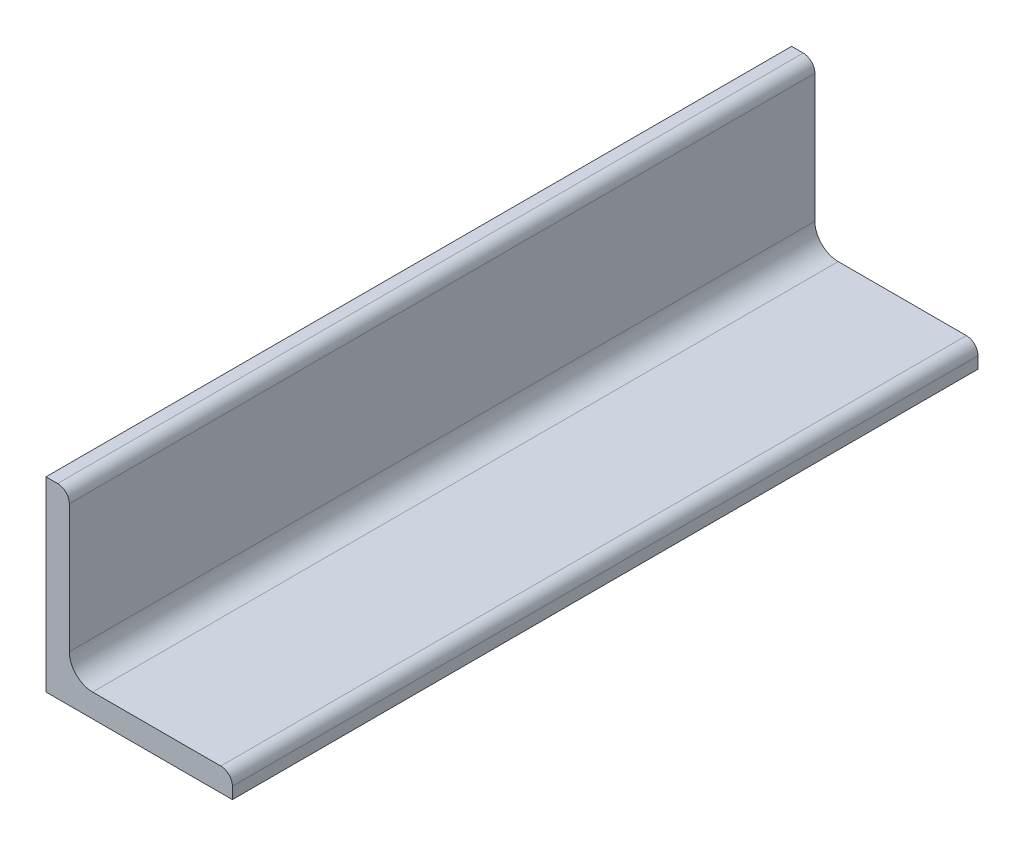
ISO-10303-21;
HEADER;
FILE_DESCRIPTION(('STEP AP214'),'2;1');
FILE_NAME('part.step','',(''),(''),'','','');
FILE_SCHEMA(('AUTOMOTIVE_DESIGN { 1 0 10303 214 1 1 1 1 }'));
ENDSEC;
DATA;
#1=APPLICATION_CONTEXT('core data for automotive mechanical design processes');
#2=APPLICATION_PROTOCOL_DEFINITION('international standard','automotive_design',2000,#1);
#3=PRODUCT_CONTEXT('',#1,'mechanical');
#4=PRODUCT('Part','Part','',(#3));
#5=PRODUCT_RELATED_PRODUCT_CATEGORY('part','',(#4));
#6=PRODUCT_DEFINITION_FORMATION('','',#4);
#7=PRODUCT_DEFINITION_CONTEXT('part definition',#1,'design');
#8=PRODUCT_DEFINITION('design','',#6,#7);
#9=PRODUCT_DEFINITION_SHAPE('','',#8);
#10=(LENGTH_UNIT() NAMED_UNIT(*) SI_UNIT(.MILLI.,.METRE.));
#11=(NAMED_UNIT(*) PLANE_ANGLE_UNIT() SI_UNIT($,.RADIAN.));
#12=(NAMED_UNIT(*) SI_UNIT($,.STERADIAN.) SOLID_ANGLE_UNIT());
#13=UNCERTAINTY_MEASURE_WITH_UNIT(LENGTH_MEASURE(1.E-05),#10,'distance_accuracy_value','');
#14=(GEOMETRIC_REPRESENTATION_CONTEXT(3) GLOBAL_UNCERTAINTY_ASSIGNED_CONTEXT((#13)) GLOBAL_UNIT_ASSIGNED_CONTEXT((#10,
#11,#12)) REPRESENTATION_CONTEXT('',''));
#15=CARTESIAN_POINT('',(0.,0.,0.));
#16=DIRECTION('',(0.,0.,1.));
#17=DIRECTION('',(1.,0.,0.));
#18=AXIS2_PLACEMENT_3D('',#15,#16,#17);
#19=CARTESIAN_POINT('',(0.490776827053332,76.2882459217981,304.8));
#20=DIRECTION('',(1.,0.,0.));
#21=DIRECTION('',(0.,0.,-1.));
#22=AXIS2_PLACEMENT_3D('',#19,#20,#21);
#23=PLANE('',#22);
#24=DIRECTION('',(0.,-1.,0.));
#25=VECTOR('',#24,1.);
#26=CARTESIAN_POINT('',(0.490776827053332,76.2882459217981,0.));
#27=LINE('',#26,#25);
#28=CARTESIAN_POINT('',(0.490776827053332,76.2882459217981,0.));
#29=VERTEX_POINT('',#28);
#30=CARTESIAN_POINT('',(0.490776827053332,0.0882459217980795,0.));
#31=VERTEX_POINT('',#30);
#32=EDGE_CURVE('E135',#29,#31,#27,.T.);
#33=ORIENTED_EDGE('',*,*,#32,.T.);
#34=DIRECTION('',(0.,0.,-1.));
#35=VECTOR('',#34,1.);
#36=CARTESIAN_POINT('',(0.490776827053332,0.0882459217980795,304.8));
#37=LINE('',#36,#35);
#38=CARTESIAN_POINT('',(0.490776827053332,0.0882459217980795,304.8));
#39=VERTEX_POINT('',#38);
#40=EDGE_CURVE('E11',#39,#31,#37,.T.);
#41=ORIENTED_EDGE('',*,*,#40,.F.);
#42=DIRECTION('',(0.,-1.,0.));
#43=VECTOR('',#42,1.);
#44=CARTESIAN_POINT('',(0.490776827053332,76.2882459217981,304.8));
#45=LINE('',#44,#43);
#46=CARTESIAN_POINT('',(0.490776827053332,76.2882459217981,304.8));
#47=VERTEX_POINT('',#46);
#48=EDGE_CURVE('E151',#47,#39,#45,.T.);
#49=ORIENTED_EDGE('',*,*,#48,.F.);
#50=DIRECTION('',(0.,0.,-1.));
#51=VECTOR('',#50,1.);
#52=CARTESIAN_POINT('',(0.490776827053332,76.2882459217981,304.8));
#53=LINE('',#52,#51);
#54=EDGE_CURVE('E131',#47,#29,#53,.T.);
#55=ORIENTED_EDGE('',*,*,#54,.T.);
#56=EDGE_LOOP('',(#33,#41,#49,#55));
#57=FACE_BOUND('',#56,.T.);
#58=ADVANCED_FACE('F33',(#57),#23,.F.);
#59=CARTESIAN_POINT('',(0.490776827053332,0.0882459217980795,304.8));
#60=DIRECTION('',(0.,1.,0.));
#61=DIRECTION('',(0.,0.,1.));
#62=AXIS2_PLACEMENT_3D('',#59,#60,#61);
#63=PLANE('',#62);
#64=DIRECTION('',(1.,0.,0.));
#65=VECTOR('',#64,1.);
#66=CARTESIAN_POINT('',(0.490776827053332,0.0882459217980795,0.));
#67=LINE('',#66,#65);
#68=CARTESIAN_POINT('',(76.6907768270533,0.0882459217980795,0.));
#69=VERTEX_POINT('',#68);
#70=EDGE_CURVE('E138',#31,#69,#67,.T.);
#71=ORIENTED_EDGE('',*,*,#70,.T.);
#72=DIRECTION('',(0.,0.,-1.));
#73=VECTOR('',#72,1.);
#74=CARTESIAN_POINT('',(76.6907768270533,0.0882459217980795,304.8));
#75=LINE('',#74,#73);
#76=CARTESIAN_POINT('',(76.6907768270533,0.0882459217980795,304.8));
#77=VERTEX_POINT('',#76);
#78=EDGE_CURVE('E41',#77,#69,#75,.T.);
#79=ORIENTED_EDGE('',*,*,#78,.F.);
#80=DIRECTION('',(1.,0.,0.));
#81=VECTOR('',#80,1.);
#82=CARTESIAN_POINT('',(0.490776827053332,0.0882459217980795,304.8));
#83=LINE('',#82,#81);
#84=EDGE_CURVE('E95',#39,#77,#83,.T.);
#85=ORIENTED_EDGE('',*,*,#84,.F.);
#86=ORIENTED_EDGE('',*,*,#40,.T.);
#87=EDGE_LOOP('',(#71,#79,#85,#86));
#88=FACE_BOUND('',#87,.T.);
#89=ADVANCED_FACE('F194',(#88),#63,.F.);
#90=CARTESIAN_POINT('',(76.6907768270533,0.0882459217980795,304.8));
#91=DIRECTION('',(-1.,0.,0.));
#92=DIRECTION('',(0.,0.,1.));
#93=AXIS2_PLACEMENT_3D('',#90,#91,#92);
#94=PLANE('',#93);
#95=DIRECTION('',(0.,1.,0.));
#96=VECTOR('',#95,1.);
#97=CARTESIAN_POINT('',(76.6907768270533,0.0882459217980795,0.));
#98=LINE('',#97,#96);
#99=CARTESIAN_POINT('',(76.6907768270533,4.85074592179808,0.));
#100=VERTEX_POINT('',#99);
#101=EDGE_CURVE('E140',#69,#100,#98,.T.);
#102=ORIENTED_EDGE('',*,*,#101,.T.);
#103=DIRECTION('',(0.,0.,-1.));
#104=VECTOR('',#103,1.);
#105=CARTESIAN_POINT('',(76.6907768270533,4.85074592179808,304.8));
#106=LINE('',#105,#104);
#107=CARTESIAN_POINT('',(76.6907768270533,4.85074592179808,304.8));
#108=VERTEX_POINT('',#107);
#109=EDGE_CURVE('E161',#108,#100,#106,.T.);
#110=ORIENTED_EDGE('',*,*,#109,.F.);
#111=DIRECTION('',(0.,1.,0.));
#112=VECTOR('',#111,1.);
#113=CARTESIAN_POINT('',(76.6907768270533,0.0882459217980795,304.8));
#114=LINE('',#113,#112);
#115=EDGE_CURVE('E169',#77,#108,#114,.T.);
#116=ORIENTED_EDGE('',*,*,#115,.F.);
#117=ORIENTED_EDGE('',*,*,#78,.T.);
#118=EDGE_LOOP('',(#102,#110,#116,#117));
#119=FACE_BOUND('',#118,.T.);
#120=ADVANCED_FACE('F167',(#119),#94,.F.);
#121=CARTESIAN_POINT('',(71.9282768270533,4.85074592179808,304.8));
#122=DIRECTION('',(0.,0.,-1.));
#123=DIRECTION('',(-1.,0.,0.));
#124=AXIS2_PLACEMENT_3D('',#121,#122,#123);
#125=CYLINDRICAL_SURFACE('',#124,4.7625);
#126=CARTESIAN_POINT('',(71.9282768270533,4.85074592179808,0.));
#127=DIRECTION('',(0.,0.,1.));
#128=DIRECTION('',(1.,0.,0.));
#129=AXIS2_PLACEMENT_3D('',#126,#127,#128);
#130=CIRCLE('',#129,4.7625);
#131=CARTESIAN_POINT('',(71.9282768270533,9.61324592179808,0.));
#132=VERTEX_POINT('',#131);
#133=EDGE_CURVE('E142',#100,#132,#130,.T.);
#134=ORIENTED_EDGE('',*,*,#133,.T.);
#135=DIRECTION('',(0.,0.,-1.));
#136=VECTOR('',#135,1.);
#137=CARTESIAN_POINT('',(71.9282768270533,9.61324592179808,304.8));
#138=LINE('',#137,#136);
#139=CARTESIAN_POINT('',(71.9282768270533,9.61324592179808,304.8));
#140=VERTEX_POINT('',#139);
#141=EDGE_CURVE('E158',#140,#132,#138,.T.);
#142=ORIENTED_EDGE('',*,*,#141,.F.);
#143=CARTESIAN_POINT('',(71.9282768270533,4.85074592179808,304.8));
#144=DIRECTION('',(0.,0.,1.));
#145=DIRECTION('',(1.,0.,0.));
#146=AXIS2_PLACEMENT_3D('',#143,#144,#145);
#147=CIRCLE('',#146,4.7625);
#148=EDGE_CURVE('E185',#108,#140,#147,.T.);
#149=ORIENTED_EDGE('',*,*,#148,.F.);
#150=ORIENTED_EDGE('',*,*,#109,.T.);
#151=EDGE_LOOP('',(#134,#142,#149,#150));
#152=FACE_BOUND('',#151,.T.);
#153=ADVANCED_FACE('F178',(#152),#125,.T.);
#154=CARTESIAN_POINT('',(71.9282768270533,9.61324592179808,304.8));
#155=DIRECTION('',(0.,-1.,0.));
#156=DIRECTION('',(0.,0.,-1.));
#157=AXIS2_PLACEMENT_3D('',#154,#155,#156);
#158=PLANE('',#157);
#159=DIRECTION('',(-1.,0.,0.));
#160=VECTOR('',#159,1.);
#161=CARTESIAN_POINT('',(71.9282768270533,9.61324592179808,0.));
#162=LINE('',#161,#160);
#163=CARTESIAN_POINT('',(19.5407768270533,9.61324592179808,0.));
#164=VERTEX_POINT('',#163);
#165=EDGE_CURVE('E144',#132,#164,#162,.T.);
#166=ORIENTED_EDGE('',*,*,#165,.T.);
#167=DIRECTION('',(0.,0.,-1.));
#168=VECTOR('',#167,1.);
#169=CARTESIAN_POINT('',(19.5407768270533,9.61324592179808,304.8));
#170=LINE('',#169,#168);
#171=CARTESIAN_POINT('',(19.5407768270533,9.61324592179808,304.8));
#172=VERTEX_POINT('',#171);
#173=EDGE_CURVE('E155',#172,#164,#170,.T.);
#174=ORIENTED_EDGE('',*,*,#173,.F.);
#175=DIRECTION('',(-1.,0.,0.));
#176=VECTOR('',#175,1.);
#177=CARTESIAN_POINT('',(71.9282768270533,9.61324592179808,304.8));
#178=LINE('',#177,#176);
#179=EDGE_CURVE('E184',#140,#172,#178,.T.);
#180=ORIENTED_EDGE('',*,*,#179,.F.);
#181=ORIENTED_EDGE('',*,*,#141,.T.);
#182=EDGE_LOOP('',(#166,#174,#180,#181));
#183=FACE_BOUND('',#182,.T.);
#184=ADVANCED_FACE('F182',(#183),#158,.F.);
#185=CARTESIAN_POINT('',(19.5407768270533,19.1382459217981,304.8));
#186=DIRECTION('',(0.,0.,-1.));
#187=DIRECTION('',(-1.,0.,0.));
#188=AXIS2_PLACEMENT_3D('',#185,#186,#187);
#189=CYLINDRICAL_SURFACE('',#188,9.52499999999999);
#190=CARTESIAN_POINT('',(19.5407768270533,19.1382459217981,0.));
#191=DIRECTION('',(0.,0.,-1.));
#192=DIRECTION('',(1.,0.,0.));
#193=AXIS2_PLACEMENT_3D('',#190,#191,#192);
#194=CIRCLE('',#193,9.52499999999999);
#195=CARTESIAN_POINT('',(10.0157768270533,19.1382459217981,0.));
#196=VERTEX_POINT('',#195);
#197=EDGE_CURVE('E146',#164,#196,#194,.T.);
#198=ORIENTED_EDGE('',*,*,#197,.T.);
#199=DIRECTION('',(0.,0.,-1.));
#200=VECTOR('',#199,1.);
#201=CARTESIAN_POINT('',(10.0157768270533,19.1382459217981,304.8));
#202=LINE('',#201,#200);
#203=CARTESIAN_POINT('',(10.0157768270533,19.1382459217981,304.8));
#204=VERTEX_POINT('',#203);
#205=EDGE_CURVE('E126',#204,#196,#202,.T.);
#206=ORIENTED_EDGE('',*,*,#205,.F.);
#207=CARTESIAN_POINT('',(19.5407768270533,19.1382459217981,304.8));
#208=DIRECTION('',(0.,0.,-1.));
#209=DIRECTION('',(1.,0.,0.));
#210=AXIS2_PLACEMENT_3D('',#207,#208,#209);
#211=CIRCLE('',#210,9.52499999999999);
#212=EDGE_CURVE('E117',#172,#204,#211,.T.);
#213=ORIENTED_EDGE('',*,*,#212,.F.);
#214=ORIENTED_EDGE('',*,*,#173,.T.);
#215=EDGE_LOOP('',(#198,#206,#213,#214));
#216=FACE_BOUND('',#215,.T.);
#217=ADVANCED_FACE('F206',(#216),#189,.F.);
#218=CARTESIAN_POINT('',(10.0157768270533,19.1382459217981,304.8));
#219=DIRECTION('',(-1.,0.,0.));
#220=DIRECTION('',(0.,0.,1.));
#221=AXIS2_PLACEMENT_3D('',#218,#219,#220);
#222=PLANE('',#221);
#223=DIRECTION('',(0.,1.,0.));
#224=VECTOR('',#223,1.);
#225=CARTESIAN_POINT('',(10.0157768270533,19.1382459217981,0.));
#226=LINE('',#225,#224);
#227=CARTESIAN_POINT('',(10.0157768270533,71.5257459217981,0.));
#228=VERTEX_POINT('',#227);
#229=EDGE_CURVE('E125',#196,#228,#226,.T.);
#230=ORIENTED_EDGE('',*,*,#229,.T.);
#231=DIRECTION('',(0.,0.,-1.));
#232=VECTOR('',#231,1.);
#233=CARTESIAN_POINT('',(10.0157768270533,71.5257459217981,304.8));
#234=LINE('',#233,#232);
#235=CARTESIAN_POINT('',(10.0157768270533,71.5257459217981,304.8));
#236=VERTEX_POINT('',#235);
#237=EDGE_CURVE('E122',#236,#228,#234,.T.);
#238=ORIENTED_EDGE('',*,*,#237,.F.);
#239=DIRECTION('',(0.,1.,0.));
#240=VECTOR('',#239,1.);
#241=CARTESIAN_POINT('',(10.0157768270533,19.1382459217981,304.8));
#242=LINE('',#241,#240);
#243=EDGE_CURVE('E111',#204,#236,#242,.T.);
#244=ORIENTED_EDGE('',*,*,#243,.F.);
#245=ORIENTED_EDGE('',*,*,#205,.T.);
#246=EDGE_LOOP('',(#230,#238,#244,#245));
#247=FACE_BOUND('',#246,.T.);
#248=ADVANCED_FACE('F123',(#247),#222,.F.);
#249=CARTESIAN_POINT('',(5.25327682705333,71.5257459217981,304.8));
#250=DIRECTION('',(0.,0.,-1.));
#251=DIRECTION('',(-1.,0.,0.));
#252=AXIS2_PLACEMENT_3D('',#249,#250,#251);
#253=CYLINDRICAL_SURFACE('',#252,4.7625);
#254=CARTESIAN_POINT('',(5.25327682705333,71.5257459217981,0.));
#255=DIRECTION('',(0.,0.,1.));
#256=DIRECTION('',(1.,0.,0.));
#257=AXIS2_PLACEMENT_3D('',#254,#255,#256);
#258=CIRCLE('',#257,4.7625);
#259=CARTESIAN_POINT('',(5.25327682705333,76.2882459217981,0.));
#260=VERTEX_POINT('',#259);
#261=EDGE_CURVE('E81',#228,#260,#258,.T.);
#262=ORIENTED_EDGE('',*,*,#261,.T.);
#263=DIRECTION('',(0.,0.,-1.));
#264=VECTOR('',#263,1.);
#265=CARTESIAN_POINT('',(5.25327682705333,76.2882459217981,304.8));
#266=LINE('',#265,#264);
#267=CARTESIAN_POINT('',(5.25327682705333,76.2882459217981,304.8));
#268=VERTEX_POINT('',#267);
#269=EDGE_CURVE('E127',#268,#260,#266,.T.);
#270=ORIENTED_EDGE('',*,*,#269,.F.);
#271=CARTESIAN_POINT('',(5.25327682705333,71.5257459217981,304.8));
#272=DIRECTION('',(0.,0.,1.));
#273=DIRECTION('',(1.,0.,0.));
#274=AXIS2_PLACEMENT_3D('',#271,#272,#273);
#275=CIRCLE('',#274,4.7625);
#276=EDGE_CURVE('E115',#236,#268,#275,.T.);
#277=ORIENTED_EDGE('',*,*,#276,.F.);
#278=ORIENTED_EDGE('',*,*,#237,.T.);
#279=EDGE_LOOP('',(#262,#270,#277,#278));
#280=FACE_BOUND('',#279,.T.);
#281=ADVANCED_FACE('F129',(#280),#253,.T.);
#282=CARTESIAN_POINT('',(5.25327682705333,76.2882459217981,304.8));
#283=DIRECTION('',(0.,-1.,0.));
#284=DIRECTION('',(0.,0.,-1.));
#285=AXIS2_PLACEMENT_3D('',#282,#283,#284);
#286=PLANE('',#285);
#287=DIRECTION('',(-1.,0.,0.));
#288=VECTOR('',#287,1.);
#289=CARTESIAN_POINT('',(5.25327682705333,76.2882459217981,0.));
#290=LINE('',#289,#288);
#291=EDGE_CURVE('E87',#260,#29,#290,.T.);
#292=ORIENTED_EDGE('',*,*,#291,.T.);
#293=ORIENTED_EDGE('',*,*,#54,.F.);
#294=DIRECTION('',(-1.,0.,0.));
#295=VECTOR('',#294,1.);
#296=CARTESIAN_POINT('',(5.25327682705333,76.2882459217981,304.8));
#297=LINE('',#296,#295);
#298=EDGE_CURVE('E49',#268,#47,#297,.T.);
#299=ORIENTED_EDGE('',*,*,#298,.F.);
#300=ORIENTED_EDGE('',*,*,#269,.T.);
#301=EDGE_LOOP('',(#292,#293,#299,#300));
#302=FACE_BOUND('',#301,.T.);
#303=ADVANCED_FACE('F214',(#302),#286,.F.);
#304=CARTESIAN_POINT('',(71.9282768270533,4.85074592179808,304.8));
#305=DIRECTION('',(0.,0.,1.));
#306=DIRECTION('',(1.,0.,0.));
#307=AXIS2_PLACEMENT_3D('',#304,#305,#306);
#308=PLANE('',#307);
#309=ORIENTED_EDGE('',*,*,#48,.T.);
#310=ORIENTED_EDGE('',*,*,#84,.T.);
#311=ORIENTED_EDGE('',*,*,#115,.T.);
#312=ORIENTED_EDGE('',*,*,#148,.T.);
#313=ORIENTED_EDGE('',*,*,#179,.T.);
#314=ORIENTED_EDGE('',*,*,#212,.T.);
#315=ORIENTED_EDGE('',*,*,#243,.T.);
#316=ORIENTED_EDGE('',*,*,#276,.T.);
#317=ORIENTED_EDGE('',*,*,#298,.T.);
#318=EDGE_LOOP('',(#309,#310,#311,#312,#313,#314,#315,#316,#317));
#319=FACE_BOUND('',#318,.T.);
#320=ADVANCED_FACE('F113',(#319),#308,.T.);
#321=CARTESIAN_POINT('',(71.9282768270533,4.85074592179808,0.));
#322=DIRECTION('',(0.,0.,1.));
#323=DIRECTION('',(1.,0.,0.));
#324=AXIS2_PLACEMENT_3D('',#321,#322,#323);
#325=PLANE('',#324);
#326=ORIENTED_EDGE('',*,*,#32,.F.);
#327=ORIENTED_EDGE('',*,*,#291,.F.);
#328=ORIENTED_EDGE('',*,*,#261,.F.);
#329=ORIENTED_EDGE('',*,*,#229,.F.);
#330=ORIENTED_EDGE('',*,*,#197,.F.);
#331=ORIENTED_EDGE('',*,*,#165,.F.);
#332=ORIENTED_EDGE('',*,*,#133,.F.);
#333=ORIENTED_EDGE('',*,*,#101,.F.);
#334=ORIENTED_EDGE('',*,*,#70,.F.);
#335=EDGE_LOOP('',(#326,#327,#328,#329,#330,#331,#332,#333,#334));
#336=FACE_BOUND('',#335,.T.);
#337=ADVANCED_FACE('F173',(#336),#325,.F.);
#338=CLOSED_SHELL('',(#58,#89,#120,#153,#184,#217,#248,#281,#303,#320,#337));
#339=MANIFOLD_SOLID_BREP('B2',#338);
#340=ADVANCED_BREP_SHAPE_REPRESENTATION('',(#18,#339),#14);
#341=SHAPE_DEFINITION_REPRESENTATION(#9,#340);
ENDSEC;
END-ISO-10303-21;
